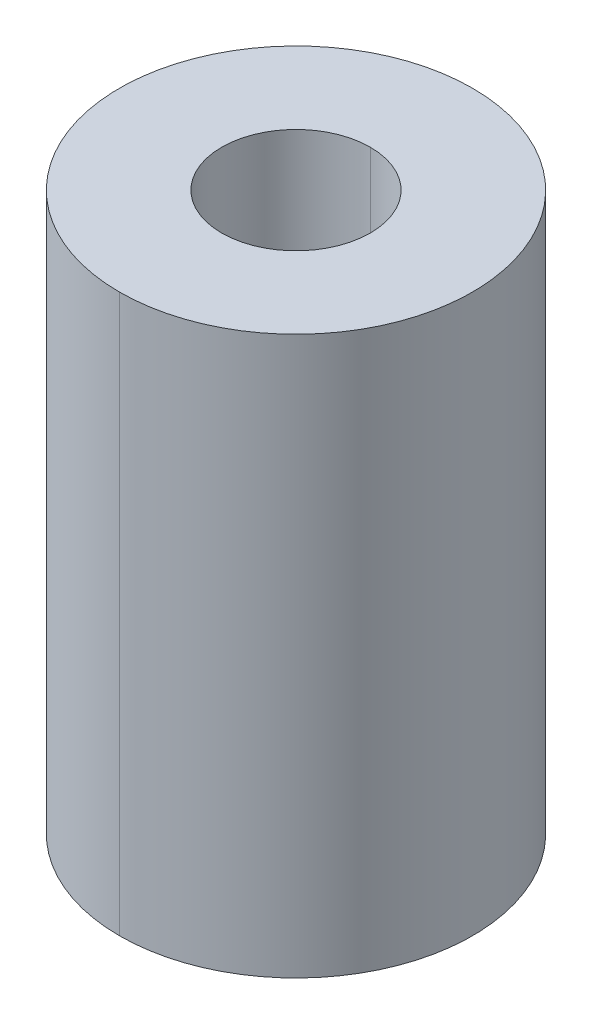
ISO-10303-21;
HEADER;
FILE_DESCRIPTION(('STEP AP214'),'2;1');
FILE_NAME('part.step','',(''),(''),'','','');
FILE_SCHEMA(('AUTOMOTIVE_DESIGN { 1 0 10303 214 1 1 1 1 }'));
ENDSEC;
DATA;
#1=APPLICATION_CONTEXT('core data for automotive mechanical design processes');
#2=APPLICATION_PROTOCOL_DEFINITION('international standard','automotive_design',2000,#1);
#3=PRODUCT_CONTEXT('',#1,'mechanical');
#4=PRODUCT('Part','Part','',(#3));
#5=PRODUCT_RELATED_PRODUCT_CATEGORY('part','',(#4));
#6=PRODUCT_DEFINITION_FORMATION('','',#4);
#7=PRODUCT_DEFINITION_CONTEXT('part definition',#1,'design');
#8=PRODUCT_DEFINITION('design','',#6,#7);
#9=PRODUCT_DEFINITION_SHAPE('','',#8);
#10=(LENGTH_UNIT() NAMED_UNIT(*) SI_UNIT(.MILLI.,.METRE.));
#11=(NAMED_UNIT(*) PLANE_ANGLE_UNIT() SI_UNIT($,.RADIAN.));
#12=(NAMED_UNIT(*) SI_UNIT($,.STERADIAN.) SOLID_ANGLE_UNIT());
#13=UNCERTAINTY_MEASURE_WITH_UNIT(LENGTH_MEASURE(1.E-05),#10,'distance_accuracy_value','');
#14=(GEOMETRIC_REPRESENTATION_CONTEXT(3) GLOBAL_UNCERTAINTY_ASSIGNED_CONTEXT((#13)) GLOBAL_UNIT_ASSIGNED_CONTEXT((#10,
#11,#12)) REPRESENTATION_CONTEXT('',''));
#15=CARTESIAN_POINT('',(0.,0.,0.));
#16=DIRECTION('',(0.,0.,1.));
#17=DIRECTION('',(1.,0.,0.));
#18=AXIS2_PLACEMENT_3D('',#15,#16,#17);
#19=CARTESIAN_POINT('',(0.,10.,0.));
#20=DIRECTION('',(0.,1.,0.));
#21=DIRECTION('',(1.,0.,0.));
#22=AXIS2_PLACEMENT_3D('',#19,#20,#21);
#23=PLANE('',#22);
#24=CARTESIAN_POINT('',(0.,10.,0.));
#25=DIRECTION('',(0.,1.,0.));
#26=DIRECTION('',(0.,0.,1.));
#27=AXIS2_PLACEMENT_3D('',#24,#25,#26);
#28=CIRCLE('',#27,4.);
#29=CARTESIAN_POINT('',(0.,10.,4.));
#30=VERTEX_POINT('',#29);
#31=CARTESIAN_POINT('',(0.,10.,-4.));
#32=VERTEX_POINT('',#31);
#33=EDGE_CURVE('E11',#30,#32,#28,.T.);
#34=ORIENTED_EDGE('',*,*,#33,.T.);
#35=CARTESIAN_POINT('',(0.,10.,0.));
#36=DIRECTION('',(0.,1.,0.));
#37=DIRECTION('',(0.,0.,1.));
#38=AXIS2_PLACEMENT_3D('',#35,#36,#37);
#39=CIRCLE('',#38,4.);
#40=EDGE_CURVE('E105',#32,#30,#39,.T.);
#41=ORIENTED_EDGE('',*,*,#40,.T.);
#42=EDGE_LOOP('',(#34,#41));
#43=FACE_BOUND('',#42,.T.);
#44=ADVANCED_FACE('F16',(#43),#23,.T.);
#45=CARTESIAN_POINT('',(0.,10.,0.));
#46=DIRECTION('',(0.,1.,0.));
#47=DIRECTION('',(0.,0.,1.));
#48=AXIS2_PLACEMENT_3D('',#45,#46,#47);
#49=CYLINDRICAL_SURFACE('',#48,4.);
#50=DIRECTION('',(0.,1.,0.));
#51=VECTOR('',#50,1.);
#52=CARTESIAN_POINT('',(0.,10.,-4.));
#53=LINE('',#52,#51);
#54=CARTESIAN_POINT('',(0.,30.,-4.));
#55=VERTEX_POINT('',#54);
#56=EDGE_CURVE('E109',#32,#55,#53,.T.);
#57=ORIENTED_EDGE('',*,*,#56,.F.);
#58=ORIENTED_EDGE('',*,*,#33,.F.);
#59=DIRECTION('',(0.,1.,0.));
#60=VECTOR('',#59,1.);
#61=CARTESIAN_POINT('',(0.,10.,4.));
#62=LINE('',#61,#60);
#63=CARTESIAN_POINT('',(0.,30.,4.));
#64=VERTEX_POINT('',#63);
#65=EDGE_CURVE('E99',#30,#64,#62,.T.);
#66=ORIENTED_EDGE('',*,*,#65,.T.);
#67=CARTESIAN_POINT('',(0.,30.,0.));
#68=DIRECTION('',(0.,-1.,0.));
#69=DIRECTION('',(0.,0.,1.));
#70=AXIS2_PLACEMENT_3D('',#67,#68,#69);
#71=CIRCLE('',#70,4.);
#72=EDGE_CURVE('E20',#55,#64,#71,.T.);
#73=ORIENTED_EDGE('',*,*,#72,.F.);
#74=EDGE_LOOP('',(#57,#58,#66,#73));
#75=FACE_BOUND('',#74,.T.);
#76=ADVANCED_FACE('F18',(#75),#49,.F.);
#77=CARTESIAN_POINT('',(0.,30.,0.));
#78=DIRECTION('',(0.,1.,0.));
#79=DIRECTION('',(1.,0.,0.));
#80=AXIS2_PLACEMENT_3D('',#77,#78,#79);
#81=PLANE('',#80);
#82=CARTESIAN_POINT('',(0.,30.,0.));
#83=DIRECTION('',(0.,-1.,0.));
#84=DIRECTION('',(0.,0.,1.));
#85=AXIS2_PLACEMENT_3D('',#82,#83,#84);
#86=CIRCLE('',#85,4.);
#87=EDGE_CURVE('E102',#64,#55,#86,.T.);
#88=ORIENTED_EDGE('',*,*,#87,.T.);
#89=ORIENTED_EDGE('',*,*,#72,.T.);
#90=EDGE_LOOP('',(#88,#89));
#91=FACE_BOUND('',#90,.T.);
#92=CARTESIAN_POINT('',(0.,30.,0.));
#93=DIRECTION('',(0.,-1.,0.));
#94=DIRECTION('',(0.,0.,-1.));
#95=AXIS2_PLACEMENT_3D('',#92,#93,#94);
#96=CIRCLE('',#95,9.5);
#97=CARTESIAN_POINT('',(0.,30.,-9.5));
#98=VERTEX_POINT('',#97);
#99=CARTESIAN_POINT('',(0.,30.,9.5));
#100=VERTEX_POINT('',#99);
#101=EDGE_CURVE('E91',#98,#100,#96,.T.);
#102=ORIENTED_EDGE('',*,*,#101,.F.);
#103=CARTESIAN_POINT('',(0.,30.,0.));
#104=DIRECTION('',(0.,-1.,0.));
#105=DIRECTION('',(0.,0.,-1.));
#106=AXIS2_PLACEMENT_3D('',#103,#104,#105);
#107=CIRCLE('',#106,9.5);
#108=EDGE_CURVE('E65',#100,#98,#107,.T.);
#109=ORIENTED_EDGE('',*,*,#108,.F.);
#110=EDGE_LOOP('',(#102,#109));
#111=FACE_BOUND('',#110,.T.);
#112=ADVANCED_FACE('F119',(#91,#111),#81,.T.);
#113=CARTESIAN_POINT('',(0.,0.,0.));
#114=DIRECTION('',(0.,1.,0.));
#115=DIRECTION('',(1.,0.,0.));
#116=AXIS2_PLACEMENT_3D('',#113,#114,#115);
#117=PLANE('',#116);
#118=CARTESIAN_POINT('',(0.,0.,0.));
#119=DIRECTION('',(0.,1.,0.));
#120=DIRECTION('',(0.,0.,-1.));
#121=AXIS2_PLACEMENT_3D('',#118,#119,#120);
#122=CIRCLE('',#121,9.5);
#123=CARTESIAN_POINT('',(0.,0.,-9.5));
#124=VERTEX_POINT('',#123);
#125=CARTESIAN_POINT('',(0.,0.,9.5));
#126=VERTEX_POINT('',#125);
#127=EDGE_CURVE('E73',#124,#126,#122,.T.);
#128=ORIENTED_EDGE('',*,*,#127,.F.);
#129=CARTESIAN_POINT('',(0.,0.,0.));
#130=DIRECTION('',(0.,1.,0.));
#131=DIRECTION('',(0.,0.,-1.));
#132=AXIS2_PLACEMENT_3D('',#129,#130,#131);
#133=CIRCLE('',#132,9.5);
#134=EDGE_CURVE('E85',#126,#124,#133,.T.);
#135=ORIENTED_EDGE('',*,*,#134,.F.);
#136=EDGE_LOOP('',(#128,#135));
#137=FACE_BOUND('',#136,.T.);
#138=ADVANCED_FACE('F86',(#137),#117,.F.);
#139=CARTESIAN_POINT('',(0.,30.,0.));
#140=DIRECTION('',(0.,-1.,0.));
#141=DIRECTION('',(0.,0.,-1.));
#142=AXIS2_PLACEMENT_3D('',#139,#140,#141);
#143=CYLINDRICAL_SURFACE('',#142,9.5);
#144=DIRECTION('',(0.,-1.,0.));
#145=VECTOR('',#144,1.);
#146=CARTESIAN_POINT('',(0.,30.,9.5));
#147=LINE('',#146,#145);
#148=EDGE_CURVE('E77',#100,#126,#147,.T.);
#149=ORIENTED_EDGE('',*,*,#148,.F.);
#150=ORIENTED_EDGE('',*,*,#108,.T.);
#151=DIRECTION('',(0.,-1.,0.));
#152=VECTOR('',#151,1.);
#153=CARTESIAN_POINT('',(0.,30.,-9.5));
#154=LINE('',#153,#152);
#155=EDGE_CURVE('E80',#98,#124,#154,.T.);
#156=ORIENTED_EDGE('',*,*,#155,.T.);
#157=ORIENTED_EDGE('',*,*,#127,.T.);
#158=EDGE_LOOP('',(#149,#150,#156,#157));
#159=FACE_BOUND('',#158,.T.);
#160=ADVANCED_FACE('F75',(#159),#143,.T.);
#161=CARTESIAN_POINT('',(0.,10.,0.));
#162=DIRECTION('',(0.,1.,0.));
#163=DIRECTION('',(0.,0.,1.));
#164=AXIS2_PLACEMENT_3D('',#161,#162,#163);
#165=CYLINDRICAL_SURFACE('',#164,4.);
#166=ORIENTED_EDGE('',*,*,#40,.F.);
#167=ORIENTED_EDGE('',*,*,#56,.T.);
#168=ORIENTED_EDGE('',*,*,#87,.F.);
#169=ORIENTED_EDGE('',*,*,#65,.F.);
#170=EDGE_LOOP('',(#166,#167,#168,#169));
#171=FACE_BOUND('',#170,.T.);
#172=ADVANCED_FACE('F124',(#171),#165,.F.);
#173=CARTESIAN_POINT('',(0.,30.,0.));
#174=DIRECTION('',(0.,-1.,0.));
#175=DIRECTION('',(0.,0.,-1.));
#176=AXIS2_PLACEMENT_3D('',#173,#174,#175);
#177=CYLINDRICAL_SURFACE('',#176,9.5);
#178=ORIENTED_EDGE('',*,*,#101,.T.);
#179=ORIENTED_EDGE('',*,*,#148,.T.);
#180=ORIENTED_EDGE('',*,*,#134,.T.);
#181=ORIENTED_EDGE('',*,*,#155,.F.);
#182=EDGE_LOOP('',(#178,#179,#180,#181));
#183=FACE_BOUND('',#182,.T.);
#184=ADVANCED_FACE('F90',(#183),#177,.T.);
#185=CLOSED_SHELL('',(#44,#76,#112,#138,#160,#172,#184));
#186=MANIFOLD_SOLID_BREP('B1',#185);
#187=ADVANCED_BREP_SHAPE_REPRESENTATION('',(#18,#186),#14);
#188=SHAPE_DEFINITION_REPRESENTATION(#9,#187);
ENDSEC;
END-ISO-10303-21;
